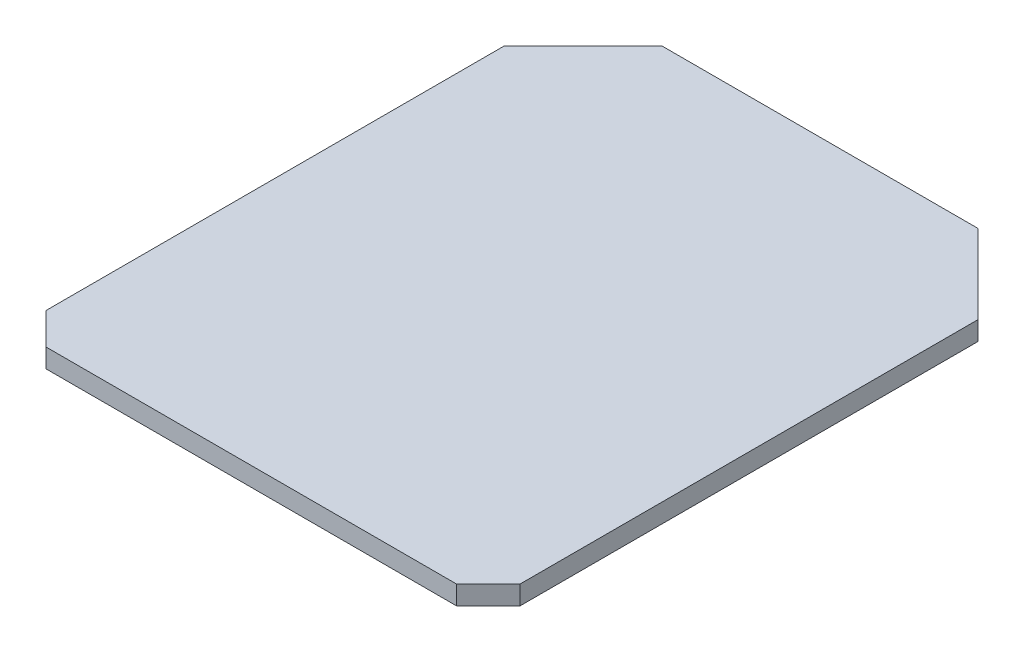
ISO-10303-21;
HEADER;
FILE_DESCRIPTION(('STEP AP214'),'2;1');
FILE_NAME('part.step','',(''),(''),'','','');
FILE_SCHEMA(('AUTOMOTIVE_DESIGN { 1 0 10303 214 1 1 1 1 }'));
ENDSEC;
DATA;
#1=APPLICATION_CONTEXT('core data for automotive mechanical design processes');
#2=APPLICATION_PROTOCOL_DEFINITION('international standard','automotive_design',2000,#1);
#3=PRODUCT_CONTEXT('',#1,'mechanical');
#4=PRODUCT('Part','Part','',(#3));
#5=PRODUCT_RELATED_PRODUCT_CATEGORY('part','',(#4));
#6=PRODUCT_DEFINITION_FORMATION('','',#4);
#7=PRODUCT_DEFINITION_CONTEXT('part definition',#1,'design');
#8=PRODUCT_DEFINITION('design','',#6,#7);
#9=PRODUCT_DEFINITION_SHAPE('','',#8);
#10=(LENGTH_UNIT() NAMED_UNIT(*) SI_UNIT(.MILLI.,.METRE.));
#11=(NAMED_UNIT(*) PLANE_ANGLE_UNIT() SI_UNIT($,.RADIAN.));
#12=(NAMED_UNIT(*) SI_UNIT($,.STERADIAN.) SOLID_ANGLE_UNIT());
#13=UNCERTAINTY_MEASURE_WITH_UNIT(LENGTH_MEASURE(1.E-05),#10,'distance_accuracy_value','');
#14=(GEOMETRIC_REPRESENTATION_CONTEXT(3) GLOBAL_UNCERTAINTY_ASSIGNED_CONTEXT((#13)) GLOBAL_UNIT_ASSIGNED_CONTEXT((#10,
#11,#12)) REPRESENTATION_CONTEXT('',''));
#15=CARTESIAN_POINT('',(0.,0.,0.));
#16=DIRECTION('',(0.,0.,1.));
#17=DIRECTION('',(1.,0.,0.));
#18=AXIS2_PLACEMENT_3D('',#15,#16,#17);
#19=CARTESIAN_POINT('',(0.,6.,-10.));
#20=DIRECTION('',(1.,0.,0.));
#21=DIRECTION('',(0.,0.,-1.));
#22=AXIS2_PLACEMENT_3D('',#19,#20,#21);
#23=PLANE('',#22);
#24=DIRECTION('',(0.,0.,1.));
#25=VECTOR('',#24,1.);
#26=CARTESIAN_POINT('',(0.,0.,-10.));
#27=LINE('',#26,#25);
#28=CARTESIAN_POINT('',(0.,0.,-155.));
#29=VERTEX_POINT('',#28);
#30=CARTESIAN_POINT('',(0.,0.,-10.));
#31=VERTEX_POINT('',#30);
#32=EDGE_CURVE('E126',#29,#31,#27,.T.);
#33=ORIENTED_EDGE('',*,*,#32,.T.);
#34=DIRECTION('',(0.,-1.,0.));
#35=VECTOR('',#34,1.);
#36=CARTESIAN_POINT('',(0.,6.,-10.));
#37=LINE('',#36,#35);
#38=CARTESIAN_POINT('',(0.,6.,-10.));
#39=VERTEX_POINT('',#38);
#40=EDGE_CURVE('E11',#39,#31,#37,.T.);
#41=ORIENTED_EDGE('',*,*,#40,.F.);
#42=DIRECTION('',(0.,0.,1.));
#43=VECTOR('',#42,1.);
#44=CARTESIAN_POINT('',(0.,6.,-10.));
#45=LINE('',#44,#43);
#46=CARTESIAN_POINT('',(0.,6.,-155.));
#47=VERTEX_POINT('',#46);
#48=EDGE_CURVE('E140',#47,#39,#45,.T.);
#49=ORIENTED_EDGE('',*,*,#48,.F.);
#50=DIRECTION('',(0.,-1.,0.));
#51=VECTOR('',#50,1.);
#52=CARTESIAN_POINT('',(0.,6.,-155.));
#53=LINE('',#52,#51);
#54=EDGE_CURVE('E122',#47,#29,#53,.T.);
#55=ORIENTED_EDGE('',*,*,#54,.T.);
#56=EDGE_LOOP('',(#33,#41,#49,#55));
#57=FACE_BOUND('',#56,.T.);
#58=ADVANCED_FACE('F30',(#57),#23,.F.);
#59=CARTESIAN_POINT('',(0.,6.,-10.));
#60=DIRECTION('',(0.707106781186547,0.,-0.707106781186547));
#61=DIRECTION('',(-0.707106781186548,0.,-0.707106781186548));
#62=AXIS2_PLACEMENT_3D('',#59,#60,#61);
#63=PLANE('',#62);
#64=DIRECTION('',(0.707106781186548,0.,0.707106781186548));
#65=VECTOR('',#64,1.);
#66=CARTESIAN_POINT('',(0.,0.,-10.));
#67=LINE('',#66,#65);
#68=CARTESIAN_POINT('',(10.,0.,0.));
#69=VERTEX_POINT('',#68);
#70=EDGE_CURVE('E129',#31,#69,#67,.T.);
#71=ORIENTED_EDGE('',*,*,#70,.T.);
#72=DIRECTION('',(0.,-1.,0.));
#73=VECTOR('',#72,1.);
#74=CARTESIAN_POINT('',(10.,6.,0.));
#75=LINE('',#74,#73);
#76=CARTESIAN_POINT('',(10.,6.,0.));
#77=VERTEX_POINT('',#76);
#78=EDGE_CURVE('E38',#77,#69,#75,.T.);
#79=ORIENTED_EDGE('',*,*,#78,.F.);
#80=DIRECTION('',(0.707106781186548,0.,0.707106781186548));
#81=VECTOR('',#80,1.);
#82=CARTESIAN_POINT('',(0.,6.,-10.));
#83=LINE('',#82,#81);
#84=EDGE_CURVE('E89',#39,#77,#83,.T.);
#85=ORIENTED_EDGE('',*,*,#84,.F.);
#86=ORIENTED_EDGE('',*,*,#40,.T.);
#87=EDGE_LOOP('',(#71,#79,#85,#86));
#88=FACE_BOUND('',#87,.T.);
#89=ADVANCED_FACE('F175',(#88),#63,.F.);
#90=CARTESIAN_POINT('',(10.,6.,0.));
#91=DIRECTION('',(0.,0.,-1.));
#92=DIRECTION('',(-1.,0.,0.));
#93=AXIS2_PLACEMENT_3D('',#90,#91,#92);
#94=PLANE('',#93);
#95=DIRECTION('',(1.,0.,0.));
#96=VECTOR('',#95,1.);
#97=CARTESIAN_POINT('',(10.,0.,0.));
#98=LINE('',#97,#96);
#99=CARTESIAN_POINT('',(140.,0.,0.));
#100=VERTEX_POINT('',#99);
#101=EDGE_CURVE('E131',#69,#100,#98,.T.);
#102=ORIENTED_EDGE('',*,*,#101,.T.);
#103=DIRECTION('',(0.,-1.,0.));
#104=VECTOR('',#103,1.);
#105=CARTESIAN_POINT('',(140.,6.,0.));
#106=LINE('',#105,#104);
#107=CARTESIAN_POINT('',(140.,6.,0.));
#108=VERTEX_POINT('',#107);
#109=EDGE_CURVE('E147',#108,#100,#106,.T.);
#110=ORIENTED_EDGE('',*,*,#109,.F.);
#111=DIRECTION('',(1.,0.,0.));
#112=VECTOR('',#111,1.);
#113=CARTESIAN_POINT('',(10.,6.,0.));
#114=LINE('',#113,#112);
#115=EDGE_CURVE('E155',#77,#108,#114,.T.);
#116=ORIENTED_EDGE('',*,*,#115,.F.);
#117=ORIENTED_EDGE('',*,*,#78,.T.);
#118=EDGE_LOOP('',(#102,#110,#116,#117));
#119=FACE_BOUND('',#118,.T.);
#120=ADVANCED_FACE('F153',(#119),#94,.F.);
#121=CARTESIAN_POINT('',(140.,6.,0.));
#122=DIRECTION('',(-0.707106781186548,0.,-0.707106781186547));
#123=DIRECTION('',(-0.707106781186547,0.,0.707106781186548));
#124=AXIS2_PLACEMENT_3D('',#121,#122,#123);
#125=PLANE('',#124);
#126=DIRECTION('',(0.707106781186547,0.,-0.707106781186548));
#127=VECTOR('',#126,1.);
#128=CARTESIAN_POINT('',(140.,0.,0.));
#129=LINE('',#128,#127);
#130=CARTESIAN_POINT('',(150.,0.,-10.));
#131=VERTEX_POINT('',#130);
#132=EDGE_CURVE('E133',#100,#131,#129,.T.);
#133=ORIENTED_EDGE('',*,*,#132,.T.);
#134=DIRECTION('',(0.,-1.,0.));
#135=VECTOR('',#134,1.);
#136=CARTESIAN_POINT('',(150.,6.,-10.));
#137=LINE('',#136,#135);
#138=CARTESIAN_POINT('',(150.,6.,-10.));
#139=VERTEX_POINT('',#138);
#140=EDGE_CURVE('E144',#139,#131,#137,.T.);
#141=ORIENTED_EDGE('',*,*,#140,.F.);
#142=DIRECTION('',(0.707106781186547,0.,-0.707106781186548));
#143=VECTOR('',#142,1.);
#144=CARTESIAN_POINT('',(140.,6.,0.));
#145=LINE('',#144,#143);
#146=EDGE_CURVE('E167',#108,#139,#145,.T.);
#147=ORIENTED_EDGE('',*,*,#146,.F.);
#148=ORIENTED_EDGE('',*,*,#109,.T.);
#149=EDGE_LOOP('',(#133,#141,#147,#148));
#150=FACE_BOUND('',#149,.T.);
#151=ADVANCED_FACE('F163',(#150),#125,.F.);
#152=CARTESIAN_POINT('',(150.,6.,-10.));
#153=DIRECTION('',(-1.,0.,0.));
#154=DIRECTION('',(0.,0.,1.));
#155=AXIS2_PLACEMENT_3D('',#152,#153,#154);
#156=PLANE('',#155);
#157=DIRECTION('',(0.,0.,-1.));
#158=VECTOR('',#157,1.);
#159=CARTESIAN_POINT('',(150.,0.,-10.));
#160=LINE('',#159,#158);
#161=CARTESIAN_POINT('',(150.,0.,-155.));
#162=VERTEX_POINT('',#161);
#163=EDGE_CURVE('E135',#131,#162,#160,.T.);
#164=ORIENTED_EDGE('',*,*,#163,.T.);
#165=DIRECTION('',(0.,-1.,0.));
#166=VECTOR('',#165,1.);
#167=CARTESIAN_POINT('',(150.,6.,-155.));
#168=LINE('',#167,#166);
#169=CARTESIAN_POINT('',(150.,6.,-155.));
#170=VERTEX_POINT('',#169);
#171=EDGE_CURVE('E117',#170,#162,#168,.T.);
#172=ORIENTED_EDGE('',*,*,#171,.F.);
#173=DIRECTION('',(0.,0.,-1.));
#174=VECTOR('',#173,1.);
#175=CARTESIAN_POINT('',(150.,6.,-10.));
#176=LINE('',#175,#174);
#177=EDGE_CURVE('E108',#139,#170,#176,.T.);
#178=ORIENTED_EDGE('',*,*,#177,.F.);
#179=ORIENTED_EDGE('',*,*,#140,.T.);
#180=EDGE_LOOP('',(#164,#172,#178,#179));
#181=FACE_BOUND('',#180,.T.);
#182=ADVANCED_FACE('F166',(#181),#156,.F.);
#183=CARTESIAN_POINT('',(125.,6.,-180.));
#184=DIRECTION('',(-0.707106781186548,0.,0.707106781186547));
#185=DIRECTION('',(0.707106781186547,0.,0.707106781186548));
#186=AXIS2_PLACEMENT_3D('',#183,#184,#185);
#187=PLANE('',#186);
#188=DIRECTION('',(-0.707106781186547,0.,-0.707106781186548));
#189=VECTOR('',#188,1.);
#190=CARTESIAN_POINT('',(125.,0.,-180.));
#191=LINE('',#190,#189);
#192=CARTESIAN_POINT('',(125.,0.,-180.));
#193=VERTEX_POINT('',#192);
#194=EDGE_CURVE('E116',#162,#193,#191,.T.);
#195=ORIENTED_EDGE('',*,*,#194,.T.);
#196=DIRECTION('',(0.,-1.,0.));
#197=VECTOR('',#196,1.);
#198=CARTESIAN_POINT('',(125.,6.,-180.));
#199=LINE('',#198,#197);
#200=CARTESIAN_POINT('',(125.,6.,-180.));
#201=VERTEX_POINT('',#200);
#202=EDGE_CURVE('E113',#201,#193,#199,.T.);
#203=ORIENTED_EDGE('',*,*,#202,.F.);
#204=DIRECTION('',(-0.707106781186547,0.,-0.707106781186548));
#205=VECTOR('',#204,1.);
#206=CARTESIAN_POINT('',(125.,6.,-180.));
#207=LINE('',#206,#205);
#208=EDGE_CURVE('E102',#170,#201,#207,.T.);
#209=ORIENTED_EDGE('',*,*,#208,.F.);
#210=ORIENTED_EDGE('',*,*,#171,.T.);
#211=EDGE_LOOP('',(#195,#203,#209,#210));
#212=FACE_BOUND('',#211,.T.);
#213=ADVANCED_FACE('F114',(#212),#187,.F.);
#214=CARTESIAN_POINT('',(25.,6.,-180.));
#215=DIRECTION('',(0.,0.,1.));
#216=DIRECTION('',(1.,0.,0.));
#217=AXIS2_PLACEMENT_3D('',#214,#215,#216);
#218=PLANE('',#217);
#219=DIRECTION('',(-1.,0.,0.));
#220=VECTOR('',#219,1.);
#221=CARTESIAN_POINT('',(25.,0.,-180.));
#222=LINE('',#221,#220);
#223=CARTESIAN_POINT('',(25.,0.,-180.));
#224=VERTEX_POINT('',#223);
#225=EDGE_CURVE('E75',#193,#224,#222,.T.);
#226=ORIENTED_EDGE('',*,*,#225,.T.);
#227=DIRECTION('',(0.,-1.,0.));
#228=VECTOR('',#227,1.);
#229=CARTESIAN_POINT('',(25.,6.,-180.));
#230=LINE('',#229,#228);
#231=CARTESIAN_POINT('',(25.,6.,-180.));
#232=VERTEX_POINT('',#231);
#233=EDGE_CURVE('E118',#232,#224,#230,.T.);
#234=ORIENTED_EDGE('',*,*,#233,.F.);
#235=DIRECTION('',(-1.,0.,0.));
#236=VECTOR('',#235,1.);
#237=CARTESIAN_POINT('',(25.,6.,-180.));
#238=LINE('',#237,#236);
#239=EDGE_CURVE('E106',#201,#232,#238,.T.);
#240=ORIENTED_EDGE('',*,*,#239,.F.);
#241=ORIENTED_EDGE('',*,*,#202,.T.);
#242=EDGE_LOOP('',(#226,#234,#240,#241));
#243=FACE_BOUND('',#242,.T.);
#244=ADVANCED_FACE('F120',(#243),#218,.F.);
#245=CARTESIAN_POINT('',(0.,6.,-155.));
#246=DIRECTION('',(0.707106781186547,0.,0.707106781186548));
#247=DIRECTION('',(0.707106781186548,0.,-0.707106781186547));
#248=AXIS2_PLACEMENT_3D('',#245,#246,#247);
#249=PLANE('',#248);
#250=DIRECTION('',(-0.707106781186548,0.,0.707106781186547));
#251=VECTOR('',#250,1.);
#252=CARTESIAN_POINT('',(0.,0.,-155.));
#253=LINE('',#252,#251);
#254=EDGE_CURVE('E81',#224,#29,#253,.T.);
#255=ORIENTED_EDGE('',*,*,#254,.T.);
#256=ORIENTED_EDGE('',*,*,#54,.F.);
#257=DIRECTION('',(-0.707106781186548,0.,0.707106781186547));
#258=VECTOR('',#257,1.);
#259=CARTESIAN_POINT('',(0.,6.,-155.));
#260=LINE('',#259,#258);
#261=EDGE_CURVE('E46',#232,#47,#260,.T.);
#262=ORIENTED_EDGE('',*,*,#261,.F.);
#263=ORIENTED_EDGE('',*,*,#233,.T.);
#264=EDGE_LOOP('',(#255,#256,#262,#263));
#265=FACE_BOUND('',#264,.T.);
#266=ADVANCED_FACE('F191',(#265),#249,.F.);
#267=CARTESIAN_POINT('',(0.,6.,-180.));
#268=DIRECTION('',(0.,-1.,0.));
#269=DIRECTION('',(0.,0.,-1.));
#270=AXIS2_PLACEMENT_3D('',#267,#268,#269);
#271=PLANE('',#270);
#272=ORIENTED_EDGE('',*,*,#48,.T.);
#273=ORIENTED_EDGE('',*,*,#84,.T.);
#274=ORIENTED_EDGE('',*,*,#115,.T.);
#275=ORIENTED_EDGE('',*,*,#146,.T.);
#276=ORIENTED_EDGE('',*,*,#177,.T.);
#277=ORIENTED_EDGE('',*,*,#208,.T.);
#278=ORIENTED_EDGE('',*,*,#239,.T.);
#279=ORIENTED_EDGE('',*,*,#261,.T.);
#280=EDGE_LOOP('',(#272,#273,#274,#275,#276,#277,#278,#279));
#281=FACE_BOUND('',#280,.T.);
#282=ADVANCED_FACE('F104',(#281),#271,.F.);
#283=CARTESIAN_POINT('',(0.,0.,-180.));
#284=DIRECTION('',(0.,-1.,0.));
#285=DIRECTION('',(0.,0.,-1.));
#286=AXIS2_PLACEMENT_3D('',#283,#284,#285);
#287=PLANE('',#286);
#288=ORIENTED_EDGE('',*,*,#32,.F.);
#289=ORIENTED_EDGE('',*,*,#254,.F.);
#290=ORIENTED_EDGE('',*,*,#225,.F.);
#291=ORIENTED_EDGE('',*,*,#194,.F.);
#292=ORIENTED_EDGE('',*,*,#163,.F.);
#293=ORIENTED_EDGE('',*,*,#132,.F.);
#294=ORIENTED_EDGE('',*,*,#101,.F.);
#295=ORIENTED_EDGE('',*,*,#70,.F.);
#296=EDGE_LOOP('',(#288,#289,#290,#291,#292,#293,#294,#295));
#297=FACE_BOUND('',#296,.T.);
#298=ADVANCED_FACE('F159',(#297),#287,.T.);
#299=CLOSED_SHELL('',(#58,#89,#120,#151,#182,#213,#244,#266,#282,#298));
#300=MANIFOLD_SOLID_BREP('B2',#299);
#301=ADVANCED_BREP_SHAPE_REPRESENTATION('',(#18,#300),#14);
#302=SHAPE_DEFINITION_REPRESENTATION(#9,#301);
ENDSEC;
END-ISO-10303-21;
